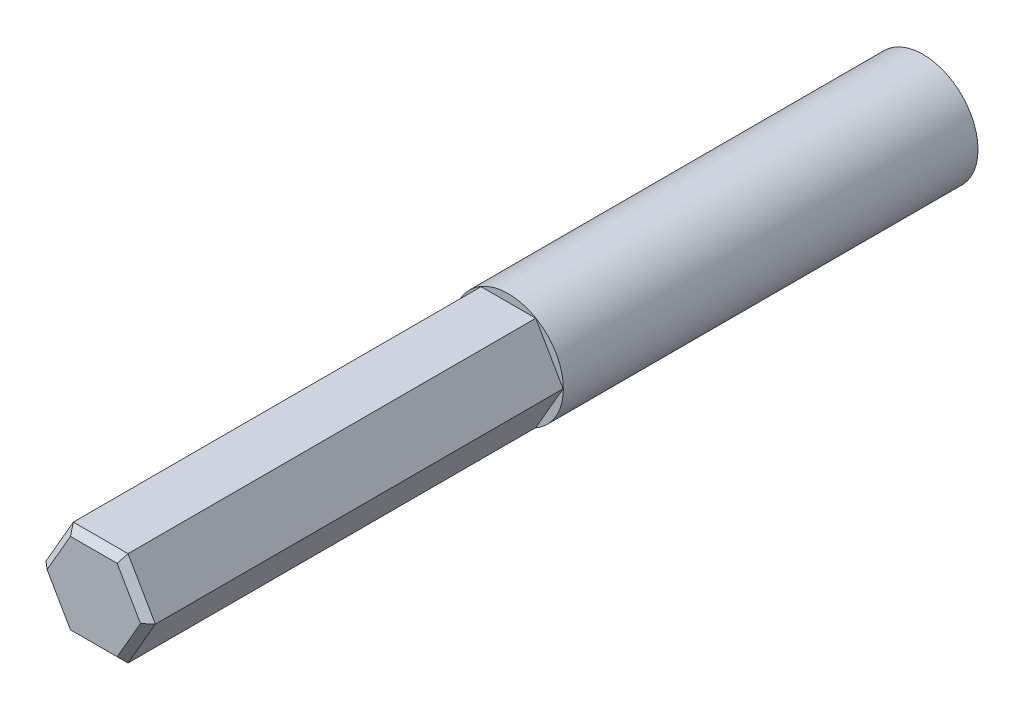
ISO-10303-21;
HEADER;
FILE_DESCRIPTION(('STEP AP214'),'2;1');
FILE_NAME('part.step','',(''),(''),'','','');
FILE_SCHEMA(('AUTOMOTIVE_DESIGN { 1 0 10303 214 1 1 1 1 }'));
ENDSEC;
DATA;
#1=APPLICATION_CONTEXT('core data for automotive mechanical design processes');
#2=APPLICATION_PROTOCOL_DEFINITION('international standard','automotive_design',2000,#1);
#3=PRODUCT_CONTEXT('',#1,'mechanical');
#4=PRODUCT('Part','Part','',(#3));
#5=PRODUCT_RELATED_PRODUCT_CATEGORY('part','',(#4));
#6=PRODUCT_DEFINITION_FORMATION('','',#4);
#7=PRODUCT_DEFINITION_CONTEXT('part definition',#1,'design');
#8=PRODUCT_DEFINITION('design','',#6,#7);
#9=PRODUCT_DEFINITION_SHAPE('','',#8);
#10=(LENGTH_UNIT() NAMED_UNIT(*) SI_UNIT(.MILLI.,.METRE.));
#11=(NAMED_UNIT(*) PLANE_ANGLE_UNIT() SI_UNIT($,.RADIAN.));
#12=(NAMED_UNIT(*) SI_UNIT($,.STERADIAN.) SOLID_ANGLE_UNIT());
#13=UNCERTAINTY_MEASURE_WITH_UNIT(LENGTH_MEASURE(1.E-05),#10,'distance_accuracy_value','');
#14=(GEOMETRIC_REPRESENTATION_CONTEXT(3) GLOBAL_UNCERTAINTY_ASSIGNED_CONTEXT((#13)) GLOBAL_UNIT_ASSIGNED_CONTEXT((#10,
#11,#12)) REPRESENTATION_CONTEXT('',''));
#15=CARTESIAN_POINT('',(0.,0.,0.));
#16=DIRECTION('',(0.,0.,1.));
#17=DIRECTION('',(1.,0.,0.));
#18=AXIS2_PLACEMENT_3D('',#15,#16,#17);
#19=CARTESIAN_POINT('',(0.,0.,30.));
#20=DIRECTION('',(0.,0.,-1.));
#21=DIRECTION('',(-1.,0.,0.));
#22=AXIS2_PLACEMENT_3D('',#19,#20,#21);
#23=CYLINDRICAL_SURFACE('',#22,3.975);
#24=CARTESIAN_POINT('',(0.,0.,30.));
#25=DIRECTION('',(0.,0.,1.));
#26=DIRECTION('',(1.,0.,0.));
#27=AXIS2_PLACEMENT_3D('',#24,#25,#26);
#28=CIRCLE('',#27,3.975);
#29=CARTESIAN_POINT('',(3.975,0.,30.));
#30=VERTEX_POINT('',#29);
#31=EDGE_CURVE('E147',#30,#30,#28,.T.);
#32=ORIENTED_EDGE('',*,*,#31,.F.);
#33=EDGE_LOOP('',(#32));
#34=FACE_BOUND('',#33,.T.);
#35=CARTESIAN_POINT('',(0.,0.,0.));
#36=DIRECTION('',(0.,0.,1.));
#37=DIRECTION('',(1.,0.,0.));
#38=AXIS2_PLACEMENT_3D('',#35,#36,#37);
#39=CIRCLE('',#38,3.975);
#40=CARTESIAN_POINT('',(3.975,0.,0.));
#41=VERTEX_POINT('',#40);
#42=EDGE_CURVE('E146',#41,#41,#39,.T.);
#43=ORIENTED_EDGE('',*,*,#42,.T.);
#44=EDGE_LOOP('',(#43));
#45=FACE_BOUND('',#44,.T.);
#46=ADVANCED_FACE('F34',(#34,#45),#23,.T.);
#47=CARTESIAN_POINT('',(0.,0.,30.));
#48=DIRECTION('',(0.,0.,1.));
#49=DIRECTION('',(1.,0.,0.));
#50=AXIS2_PLACEMENT_3D('',#47,#48,#49);
#51=PLANE('',#50);
#52=DIRECTION('',(0.499999999999999,0.866025403784439,0.));
#53=VECTOR('',#52,1.);
#54=CARTESIAN_POINT('',(1.97834936490539,-3.42660161513776,30.));
#55=LINE('',#54,#53);
#56=CARTESIAN_POINT('',(1.97834936490539,-3.42660161513776,30.));
#57=VERTEX_POINT('',#56);
#58=CARTESIAN_POINT('',(3.95669872981078,0.,30.));
#59=VERTEX_POINT('',#58);
#60=EDGE_CURVE('E127',#57,#59,#55,.T.);
#61=ORIENTED_EDGE('',*,*,#60,.F.);
#62=DIRECTION('',(1.,0.,0.));
#63=VECTOR('',#62,1.);
#64=CARTESIAN_POINT('',(-1.97834936490539,-3.42660161513776,30.));
#65=LINE('',#64,#63);
#66=CARTESIAN_POINT('',(-1.97834936490539,-3.42660161513776,30.));
#67=VERTEX_POINT('',#66);
#68=EDGE_CURVE('E135',#67,#57,#65,.T.);
#69=ORIENTED_EDGE('',*,*,#68,.F.);
#70=DIRECTION('',(0.5,-0.866025403784439,0.));
#71=VECTOR('',#70,1.);
#72=CARTESIAN_POINT('',(-3.95669872981078,0.,30.));
#73=LINE('',#72,#71);
#74=CARTESIAN_POINT('',(-3.95669872981078,0.,30.));
#75=VERTEX_POINT('',#74);
#76=EDGE_CURVE('E132',#75,#67,#73,.T.);
#77=ORIENTED_EDGE('',*,*,#76,.F.);
#78=DIRECTION('',(-0.5,-0.866025403784439,0.));
#79=VECTOR('',#78,1.);
#80=CARTESIAN_POINT('',(-1.97834936490539,3.42660161513776,30.));
#81=LINE('',#80,#79);
#82=CARTESIAN_POINT('',(-1.97834936490539,3.42660161513776,30.));
#83=VERTEX_POINT('',#82);
#84=EDGE_CURVE('E124',#83,#75,#81,.T.);
#85=ORIENTED_EDGE('',*,*,#84,.F.);
#86=DIRECTION('',(-1.,0.,0.));
#87=VECTOR('',#86,1.);
#88=CARTESIAN_POINT('',(1.97834936490539,3.42660161513776,30.));
#89=LINE('',#88,#87);
#90=CARTESIAN_POINT('',(1.97834936490539,3.42660161513776,30.));
#91=VERTEX_POINT('',#90);
#92=EDGE_CURVE('E108',#91,#83,#89,.T.);
#93=ORIENTED_EDGE('',*,*,#92,.F.);
#94=DIRECTION('',(-0.5,0.866025403784439,0.));
#95=VECTOR('',#94,1.);
#96=CARTESIAN_POINT('',(3.95669872981078,0.,30.));
#97=LINE('',#96,#95);
#98=EDGE_CURVE('E120',#59,#91,#97,.T.);
#99=ORIENTED_EDGE('',*,*,#98,.F.);
#100=EDGE_LOOP('',(#61,#69,#77,#85,#93,#99));
#101=FACE_BOUND('',#100,.T.);
#102=ORIENTED_EDGE('',*,*,#31,.T.);
#103=EDGE_LOOP('',(#102));
#104=FACE_BOUND('',#103,.T.);
#105=ADVANCED_FACE('F118',(#101,#104),#51,.T.);
#106=CARTESIAN_POINT('',(0.,0.,0.));
#107=DIRECTION('',(0.,0.,1.));
#108=DIRECTION('',(1.,0.,0.));
#109=AXIS2_PLACEMENT_3D('',#106,#107,#108);
#110=PLANE('',#109);
#111=ORIENTED_EDGE('',*,*,#42,.F.);
#112=EDGE_LOOP('',(#111));
#113=FACE_BOUND('',#112,.T.);
#114=ADVANCED_FACE('F238',(#113),#110,.F.);
#115=CARTESIAN_POINT('',(1.97834936490539,-3.42660161513776,60.));
#116=DIRECTION('',(-0.866025403784439,0.499999999999999,0.));
#117=DIRECTION('',(-0.499999999999999,-0.866025403784439,0.));
#118=AXIS2_PLACEMENT_3D('',#115,#116,#117);
#119=PLANE('',#118);
#120=DIRECTION('',(0.,0.,-1.));
#121=VECTOR('',#120,1.);
#122=CARTESIAN_POINT('',(3.95669872981078,0.,60.));
#123=LINE('',#122,#121);
#124=CARTESIAN_POINT('',(3.95669872981078,0.,59.5));
#125=VERTEX_POINT('',#124);
#126=EDGE_CURVE('E111',#125,#59,#123,.T.);
#127=ORIENTED_EDGE('',*,*,#126,.F.);
#128=DIRECTION('',(-0.499999999999999,-0.866025403784439,0.));
#129=VECTOR('',#128,1.);
#130=CARTESIAN_POINT('',(1.97834936490539,-3.42660161513776,59.5));
#131=LINE('',#130,#129);
#132=CARTESIAN_POINT('',(1.97834936490539,-3.42660161513776,59.5));
#133=VERTEX_POINT('',#132);
#134=EDGE_CURVE('E11',#125,#133,#131,.T.);
#135=ORIENTED_EDGE('',*,*,#134,.T.);
#136=DIRECTION('',(0.,0.,-1.));
#137=VECTOR('',#136,1.);
#138=CARTESIAN_POINT('',(1.97834936490539,-3.42660161513776,60.));
#139=LINE('',#138,#137);
#140=EDGE_CURVE('E138',#133,#57,#139,.T.);
#141=ORIENTED_EDGE('',*,*,#140,.T.);
#142=ORIENTED_EDGE('',*,*,#60,.T.);
#143=EDGE_LOOP('',(#127,#135,#141,#142));
#144=FACE_BOUND('',#143,.T.);
#145=ADVANCED_FACE('F205',(#144),#119,.F.);
#146=CARTESIAN_POINT('',(3.95669872981078,0.,60.));
#147=DIRECTION('',(-0.866025403784439,-0.5,0.));
#148=DIRECTION('',(0.5,-0.866025403784439,0.));
#149=AXIS2_PLACEMENT_3D('',#146,#147,#148);
#150=PLANE('',#149);
#151=DIRECTION('',(0.,0.,-1.));
#152=VECTOR('',#151,1.);
#153=CARTESIAN_POINT('',(1.97834936490539,3.42660161513776,60.));
#154=LINE('',#153,#152);
#155=CARTESIAN_POINT('',(1.97834936490539,3.42660161513776,59.5));
#156=VERTEX_POINT('',#155);
#157=EDGE_CURVE('E105',#156,#91,#154,.T.);
#158=ORIENTED_EDGE('',*,*,#157,.F.);
#159=DIRECTION('',(0.5,-0.866025403784439,0.));
#160=VECTOR('',#159,1.);
#161=CARTESIAN_POINT('',(3.95669872981078,0.,59.5));
#162=LINE('',#161,#160);
#163=EDGE_CURVE('E44',#156,#125,#162,.T.);
#164=ORIENTED_EDGE('',*,*,#163,.T.);
#165=ORIENTED_EDGE('',*,*,#126,.T.);
#166=ORIENTED_EDGE('',*,*,#98,.T.);
#167=EDGE_LOOP('',(#158,#164,#165,#166));
#168=FACE_BOUND('',#167,.T.);
#169=ADVANCED_FACE('F126',(#168),#150,.F.);
#170=CARTESIAN_POINT('',(1.97834936490539,3.42660161513776,60.));
#171=DIRECTION('',(0.,-1.,0.));
#172=DIRECTION('',(1.,0.,0.));
#173=AXIS2_PLACEMENT_3D('',#170,#171,#172);
#174=PLANE('',#173);
#175=DIRECTION('',(0.,0.,-1.));
#176=VECTOR('',#175,1.);
#177=CARTESIAN_POINT('',(-1.97834936490539,3.42660161513776,60.));
#178=LINE('',#177,#176);
#179=CARTESIAN_POINT('',(-1.97834936490539,3.42660161513776,59.5));
#180=VERTEX_POINT('',#179);
#181=EDGE_CURVE('E112',#180,#83,#178,.T.);
#182=ORIENTED_EDGE('',*,*,#181,.F.);
#183=DIRECTION('',(1.,0.,0.));
#184=VECTOR('',#183,1.);
#185=CARTESIAN_POINT('',(1.97834936490539,3.42660161513776,59.5));
#186=LINE('',#185,#184);
#187=EDGE_CURVE('E59',#180,#156,#186,.T.);
#188=ORIENTED_EDGE('',*,*,#187,.T.);
#189=ORIENTED_EDGE('',*,*,#157,.T.);
#190=ORIENTED_EDGE('',*,*,#92,.T.);
#191=EDGE_LOOP('',(#182,#188,#189,#190));
#192=FACE_BOUND('',#191,.T.);
#193=ADVANCED_FACE('F107',(#192),#174,.F.);
#194=CARTESIAN_POINT('',(-1.97834936490539,3.42660161513776,60.));
#195=DIRECTION('',(0.866025403784439,-0.5,0.));
#196=DIRECTION('',(0.5,0.866025403784439,0.));
#197=AXIS2_PLACEMENT_3D('',#194,#195,#196);
#198=PLANE('',#197);
#199=DIRECTION('',(0.,0.,-1.));
#200=VECTOR('',#199,1.);
#201=CARTESIAN_POINT('',(-3.95669872981078,0.,60.));
#202=LINE('',#201,#200);
#203=CARTESIAN_POINT('',(-3.95669872981078,0.,59.5));
#204=VERTEX_POINT('',#203);
#205=EDGE_CURVE('E142',#204,#75,#202,.T.);
#206=ORIENTED_EDGE('',*,*,#205,.F.);
#207=DIRECTION('',(0.5,0.866025403784439,0.));
#208=VECTOR('',#207,1.);
#209=CARTESIAN_POINT('',(-1.97834936490539,3.42660161513776,59.5));
#210=LINE('',#209,#208);
#211=EDGE_CURVE('E170',#204,#180,#210,.T.);
#212=ORIENTED_EDGE('',*,*,#211,.T.);
#213=ORIENTED_EDGE('',*,*,#181,.T.);
#214=ORIENTED_EDGE('',*,*,#84,.T.);
#215=EDGE_LOOP('',(#206,#212,#213,#214));
#216=FACE_BOUND('',#215,.T.);
#217=ADVANCED_FACE('F223',(#216),#198,.F.);
#218=CARTESIAN_POINT('',(-3.95669872981078,0.,60.));
#219=DIRECTION('',(0.866025403784438,0.5,0.));
#220=DIRECTION('',(-0.5,0.866025403784439,0.));
#221=AXIS2_PLACEMENT_3D('',#218,#219,#220);
#222=PLANE('',#221);
#223=DIRECTION('',(0.,0.,-1.));
#224=VECTOR('',#223,1.);
#225=CARTESIAN_POINT('',(-1.97834936490539,-3.42660161513776,60.));
#226=LINE('',#225,#224);
#227=CARTESIAN_POINT('',(-1.97834936490539,-3.42660161513776,59.5));
#228=VERTEX_POINT('',#227);
#229=EDGE_CURVE('E140',#228,#67,#226,.T.);
#230=ORIENTED_EDGE('',*,*,#229,.F.);
#231=DIRECTION('',(-0.5,0.866025403784439,0.));
#232=VECTOR('',#231,1.);
#233=CARTESIAN_POINT('',(-3.95669872981078,0.,59.5));
#234=LINE('',#233,#232);
#235=EDGE_CURVE('E168',#228,#204,#234,.T.);
#236=ORIENTED_EDGE('',*,*,#235,.T.);
#237=ORIENTED_EDGE('',*,*,#205,.T.);
#238=ORIENTED_EDGE('',*,*,#76,.T.);
#239=EDGE_LOOP('',(#230,#236,#237,#238));
#240=FACE_BOUND('',#239,.T.);
#241=ADVANCED_FACE('F221',(#240),#222,.F.);
#242=CARTESIAN_POINT('',(-1.97834936490539,-3.42660161513776,60.));
#243=DIRECTION('',(0.,1.,0.));
#244=DIRECTION('',(-1.,0.,0.));
#245=AXIS2_PLACEMENT_3D('',#242,#243,#244);
#246=PLANE('',#245);
#247=ORIENTED_EDGE('',*,*,#140,.F.);
#248=DIRECTION('',(-1.,0.,0.));
#249=VECTOR('',#248,1.);
#250=CARTESIAN_POINT('',(-1.97834936490539,-3.42660161513776,59.5));
#251=LINE('',#250,#249);
#252=EDGE_CURVE('E165',#133,#228,#251,.T.);
#253=ORIENTED_EDGE('',*,*,#252,.T.);
#254=ORIENTED_EDGE('',*,*,#229,.T.);
#255=ORIENTED_EDGE('',*,*,#68,.T.);
#256=EDGE_LOOP('',(#247,#253,#254,#255));
#257=FACE_BOUND('',#256,.T.);
#258=ADVANCED_FACE('F208',(#257),#246,.F.);
#259=CARTESIAN_POINT('',(0.,0.,60.));
#260=DIRECTION('',(0.,0.,1.));
#261=DIRECTION('',(1.,0.,0.));
#262=AXIS2_PLACEMENT_3D('',#259,#260,#261);
#263=PLANE('',#262);
#264=DIRECTION('',(0.5,-0.866025403784438,0.));
#265=VECTOR('',#264,1.);
#266=CARTESIAN_POINT('',(-1.54533666301317,-3.17660161513776,60.));
#267=LINE('',#266,#265);
#268=CARTESIAN_POINT('',(-3.37934846062115,0.,60.));
#269=VERTEX_POINT('',#268);
#270=CARTESIAN_POINT('',(-1.68967423031057,-2.92660161513776,60.));
#271=VERTEX_POINT('',#270);
#272=EDGE_CURVE('E160',#269,#271,#267,.T.);
#273=ORIENTED_EDGE('',*,*,#272,.T.);
#274=DIRECTION('',(1.,0.,0.));
#275=VECTOR('',#274,1.);
#276=CARTESIAN_POINT('',(1.97834936490539,-2.92660161513775,60.));
#277=LINE('',#276,#275);
#278=CARTESIAN_POINT('',(1.68967423031058,-2.92660161513775,60.));
#279=VERTEX_POINT('',#278);
#280=EDGE_CURVE('E162',#271,#279,#277,.T.);
#281=ORIENTED_EDGE('',*,*,#280,.T.);
#282=DIRECTION('',(0.499999999999999,0.866025403784439,0.));
#283=VECTOR('',#282,1.);
#284=CARTESIAN_POINT('',(3.52368602791856,0.250000000000003,60.));
#285=LINE('',#284,#283);
#286=CARTESIAN_POINT('',(3.37934846062115,0.,60.));
#287=VERTEX_POINT('',#286);
#288=EDGE_CURVE('E150',#279,#287,#285,.T.);
#289=ORIENTED_EDGE('',*,*,#288,.T.);
#290=DIRECTION('',(-0.5,0.866025403784439,0.));
#291=VECTOR('',#290,1.);
#292=CARTESIAN_POINT('',(1.54533666301317,3.17660161513776,60.));
#293=LINE('',#292,#291);
#294=CARTESIAN_POINT('',(1.68967423031058,2.92660161513775,60.));
#295=VERTEX_POINT('',#294);
#296=EDGE_CURVE('E154',#287,#295,#293,.T.);
#297=ORIENTED_EDGE('',*,*,#296,.T.);
#298=DIRECTION('',(-1.,0.,0.));
#299=VECTOR('',#298,1.);
#300=CARTESIAN_POINT('',(-1.97834936490539,2.92660161513775,60.));
#301=LINE('',#300,#299);
#302=CARTESIAN_POINT('',(-1.68967423031058,2.92660161513775,60.));
#303=VERTEX_POINT('',#302);
#304=EDGE_CURVE('E156',#295,#303,#301,.T.);
#305=ORIENTED_EDGE('',*,*,#304,.T.);
#306=DIRECTION('',(-0.5,-0.866025403784439,0.));
#307=VECTOR('',#306,1.);
#308=CARTESIAN_POINT('',(-3.52368602791856,-0.250000000000002,60.));
#309=LINE('',#308,#307);
#310=EDGE_CURVE('E158',#303,#269,#309,.T.);
#311=ORIENTED_EDGE('',*,*,#310,.T.);
#312=EDGE_LOOP('',(#273,#281,#289,#297,#305,#311));
#313=FACE_BOUND('',#312,.T.);
#314=ADVANCED_FACE('F270',(#313),#263,.T.);
#315=CARTESIAN_POINT('',(0.,2.92660161513775,60.));
#316=DIRECTION('',(0.,0.707106781186546,0.707106781186549));
#317=DIRECTION('',(1.,0.,0.));
#318=AXIS2_PLACEMENT_3D('',#315,#316,#317);
#319=PLANE('',#318);
#320=DIRECTION('',(-0.377964473009227,-0.654653670707979,0.654653670707976));
#321=VECTOR('',#320,1.);
#322=CARTESIAN_POINT('',(1.44829219740907,2.50851567011807,60.4180859450197));
#323=LINE('',#322,#321);
#324=EDGE_CURVE('E183',#156,#295,#323,.T.);
#325=ORIENTED_EDGE('',*,*,#324,.F.);
#326=ORIENTED_EDGE('',*,*,#187,.F.);
#327=DIRECTION('',(0.377964473009226,-0.654653670707979,0.654653670707976));
#328=VECTOR('',#327,1.);
#329=CARTESIAN_POINT('',(-1.44829219740907,2.50851567011807,60.4180859450197));
#330=LINE('',#329,#328);
#331=EDGE_CURVE('E39',#303,#180,#330,.F.);
#332=ORIENTED_EDGE('',*,*,#331,.F.);
#333=ORIENTED_EDGE('',*,*,#304,.F.);
#334=EDGE_LOOP('',(#325,#326,#332,#333));
#335=FACE_BOUND('',#334,.T.);
#336=ADVANCED_FACE('F37',(#335),#319,.T.);
#337=CARTESIAN_POINT('',(-2.53451134546586,1.46330080756888,60.));
#338=DIRECTION('',(-0.612372435695794,0.353553390593273,0.707106781186548));
#339=DIRECTION('',(0.5,0.866025403784439,0.));
#340=AXIS2_PLACEMENT_3D('',#337,#338,#339);
#341=PLANE('',#340);
#342=ORIENTED_EDGE('',*,*,#331,.T.);
#343=ORIENTED_EDGE('',*,*,#211,.F.);
#344=DIRECTION('',(0.755928946018455,0.,0.654653670707977));
#345=VECTOR('',#344,1.);
#346=CARTESIAN_POINT('',(-2.89658439481813,0.,60.4180859450197));
#347=LINE('',#346,#345);
#348=EDGE_CURVE('E181',#269,#204,#347,.F.);
#349=ORIENTED_EDGE('',*,*,#348,.F.);
#350=ORIENTED_EDGE('',*,*,#310,.F.);
#351=EDGE_LOOP('',(#342,#343,#349,#350));
#352=FACE_BOUND('',#351,.T.);
#353=ADVANCED_FACE('F192',(#352),#341,.T.);
#354=CARTESIAN_POINT('',(2.53451134546586,1.46330080756888,60.));
#355=DIRECTION('',(0.612372435695794,0.353553390593273,0.707106781186548));
#356=DIRECTION('',(0.5,-0.866025403784439,0.));
#357=AXIS2_PLACEMENT_3D('',#354,#355,#356);
#358=PLANE('',#357);
#359=ORIENTED_EDGE('',*,*,#324,.T.);
#360=ORIENTED_EDGE('',*,*,#296,.F.);
#361=DIRECTION('',(-0.755928946018455,0.,0.654653670707976));
#362=VECTOR('',#361,1.);
#363=CARTESIAN_POINT('',(2.89658439481813,0.,60.4180859450197));
#364=LINE('',#363,#362);
#365=EDGE_CURVE('E178',#125,#287,#364,.T.);
#366=ORIENTED_EDGE('',*,*,#365,.F.);
#367=ORIENTED_EDGE('',*,*,#163,.F.);
#368=EDGE_LOOP('',(#359,#360,#366,#367));
#369=FACE_BOUND('',#368,.T.);
#370=ADVANCED_FACE('F197',(#369),#358,.T.);
#371=CARTESIAN_POINT('',(-2.53451134546586,-1.46330080756888,60.));
#372=DIRECTION('',(-0.612372435695794,-0.353553390593274,0.707106781186548));
#373=DIRECTION('',(-0.5,0.866025403784439,0.));
#374=AXIS2_PLACEMENT_3D('',#371,#372,#373);
#375=PLANE('',#374);
#376=ORIENTED_EDGE('',*,*,#348,.T.);
#377=ORIENTED_EDGE('',*,*,#235,.F.);
#378=DIRECTION('',(0.377964473009227,0.654653670707979,0.654653670707976));
#379=VECTOR('',#378,1.);
#380=CARTESIAN_POINT('',(-1.44829219740906,-2.50851567011807,60.4180859450197));
#381=LINE('',#380,#379);
#382=EDGE_CURVE('E176',#271,#228,#381,.F.);
#383=ORIENTED_EDGE('',*,*,#382,.F.);
#384=ORIENTED_EDGE('',*,*,#272,.F.);
#385=EDGE_LOOP('',(#376,#377,#383,#384));
#386=FACE_BOUND('',#385,.T.);
#387=ADVANCED_FACE('F218',(#386),#375,.T.);
#388=CARTESIAN_POINT('',(2.53451134546586,-1.46330080756888,60.));
#389=DIRECTION('',(0.612372435695794,-0.353553390593273,0.707106781186549));
#390=DIRECTION('',(-0.499999999999999,-0.866025403784439,0.));
#391=AXIS2_PLACEMENT_3D('',#388,#389,#390);
#392=PLANE('',#391);
#393=ORIENTED_EDGE('',*,*,#365,.T.);
#394=ORIENTED_EDGE('',*,*,#288,.F.);
#395=DIRECTION('',(0.377964473009228,-0.654653670707978,-0.654653670707976));
#396=VECTOR('',#395,1.);
#397=CARTESIAN_POINT('',(1.44829219740907,-2.50851567011807,60.4180859450197));
#398=LINE('',#397,#396);
#399=EDGE_CURVE('E174',#133,#279,#398,.F.);
#400=ORIENTED_EDGE('',*,*,#399,.F.);
#401=ORIENTED_EDGE('',*,*,#134,.F.);
#402=EDGE_LOOP('',(#393,#394,#400,#401));
#403=FACE_BOUND('',#402,.T.);
#404=ADVANCED_FACE('F202',(#403),#392,.T.);
#405=CARTESIAN_POINT('',(0.,-2.92660161513776,60.));
#406=DIRECTION('',(0.,-0.707106781186546,0.707106781186549));
#407=DIRECTION('',(-1.,0.,0.));
#408=AXIS2_PLACEMENT_3D('',#405,#406,#407);
#409=PLANE('',#408);
#410=ORIENTED_EDGE('',*,*,#382,.T.);
#411=ORIENTED_EDGE('',*,*,#252,.F.);
#412=ORIENTED_EDGE('',*,*,#399,.T.);
#413=ORIENTED_EDGE('',*,*,#280,.F.);
#414=EDGE_LOOP('',(#410,#411,#412,#413));
#415=FACE_BOUND('',#414,.T.);
#416=ADVANCED_FACE('F212',(#415),#409,.T.);
#417=CLOSED_SHELL('',(#46,#105,#114,#145,#169,#193,#217,#241,#258,#314,#336,#353,#370,#387,#404,#416));
#418=MANIFOLD_SOLID_BREP('B2',#417);
#419=ADVANCED_BREP_SHAPE_REPRESENTATION('',(#18,#418),#14);
#420=SHAPE_DEFINITION_REPRESENTATION(#9,#419);
ENDSEC;
END-ISO-10303-21;
